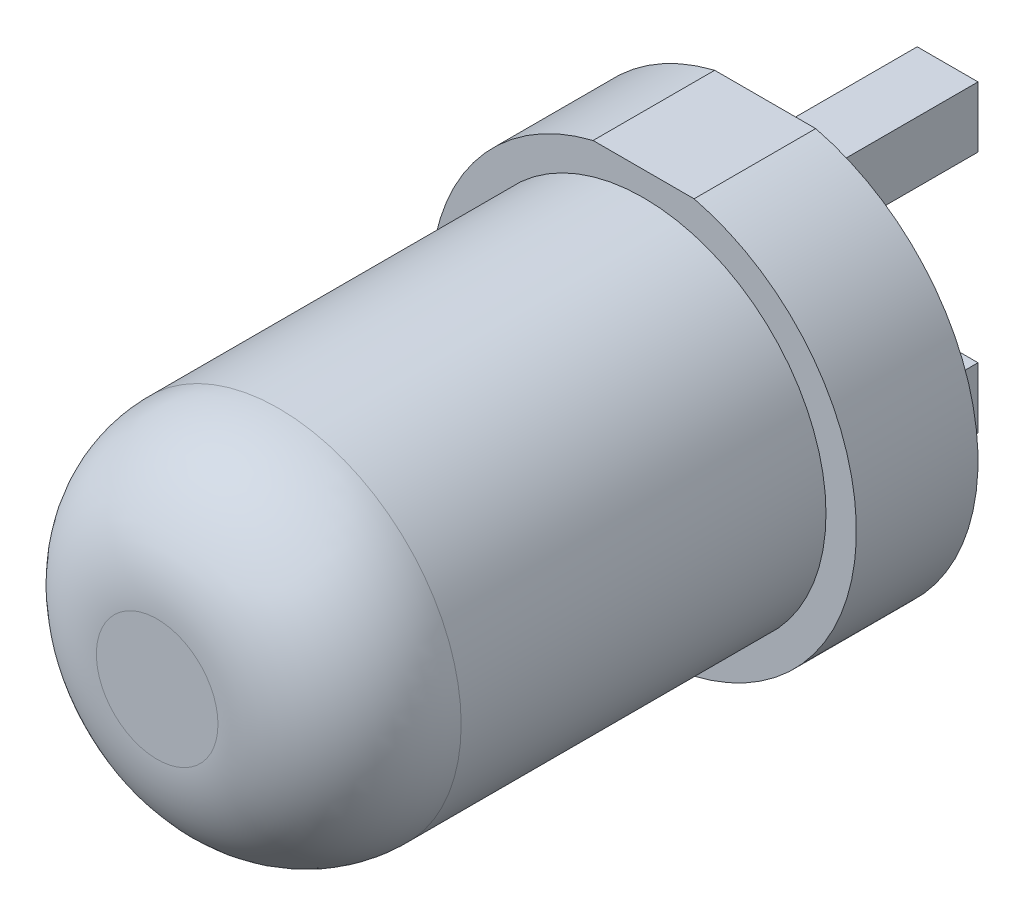
ISO-10303-21;
HEADER;
FILE_DESCRIPTION(('STEP AP214'),'2;1');
FILE_NAME('part.step','',(''),(''),'','','');
FILE_SCHEMA(('AUTOMOTIVE_DESIGN { 1 0 10303 214 1 1 1 1 }'));
ENDSEC;
DATA;
#1=APPLICATION_CONTEXT('core data for automotive mechanical design processes');
#2=APPLICATION_PROTOCOL_DEFINITION('international standard','automotive_design',2000,#1);
#3=PRODUCT_CONTEXT('',#1,'mechanical');
#4=PRODUCT('Part','Part','',(#3));
#5=PRODUCT_RELATED_PRODUCT_CATEGORY('part','',(#4));
#6=PRODUCT_DEFINITION_FORMATION('','',#4);
#7=PRODUCT_DEFINITION_CONTEXT('part definition',#1,'design');
#8=PRODUCT_DEFINITION('design','',#6,#7);
#9=PRODUCT_DEFINITION_SHAPE('','',#8);
#10=(LENGTH_UNIT() NAMED_UNIT(*) SI_UNIT(.MILLI.,.METRE.));
#11=(NAMED_UNIT(*) PLANE_ANGLE_UNIT() SI_UNIT($,.RADIAN.));
#12=(NAMED_UNIT(*) SI_UNIT($,.STERADIAN.) SOLID_ANGLE_UNIT());
#13=UNCERTAINTY_MEASURE_WITH_UNIT(LENGTH_MEASURE(1.E-05),#10,'distance_accuracy_value','');
#14=(GEOMETRIC_REPRESENTATION_CONTEXT(3) GLOBAL_UNCERTAINTY_ASSIGNED_CONTEXT((#13)) GLOBAL_UNIT_ASSIGNED_CONTEXT((#10,
#11,#12)) REPRESENTATION_CONTEXT('',''));
#15=CARTESIAN_POINT('',(0.,0.,0.));
#16=DIRECTION('',(0.,0.,1.));
#17=DIRECTION('',(1.,0.,0.));
#18=AXIS2_PLACEMENT_3D('',#15,#16,#17);
#19=CARTESIAN_POINT('',(0.,0.,-0.5));
#20=DIRECTION('',(0.,0.,1.));
#21=DIRECTION('',(1.,0.,0.));
#22=AXIS2_PLACEMENT_3D('',#19,#20,#21);
#23=PLANE('',#22);
#24=DIRECTION('',(0.,-1.,0.));
#25=VECTOR('',#24,1.);
#26=CARTESIAN_POINT('',(0.25,-0.8,-0.5));
#27=LINE('',#26,#25);
#28=CARTESIAN_POINT('',(0.25,-0.8,-0.5));
#29=VERTEX_POINT('',#28);
#30=CARTESIAN_POINT('',(0.25,-1.3,-0.5));
#31=VERTEX_POINT('',#30);
#32=EDGE_CURVE('E162',#29,#31,#27,.T.);
#33=ORIENTED_EDGE('',*,*,#32,.F.);
#34=DIRECTION('',(1.,0.,0.));
#35=VECTOR('',#34,1.);
#36=CARTESIAN_POINT('',(0.25,-0.8,-0.5));
#37=LINE('',#36,#35);
#38=CARTESIAN_POINT('',(-0.25,-0.8,-0.5));
#39=VERTEX_POINT('',#38);
#40=EDGE_CURVE('E171',#39,#29,#37,.T.);
#41=ORIENTED_EDGE('',*,*,#40,.F.);
#42=DIRECTION('',(0.,1.,0.));
#43=VECTOR('',#42,1.);
#44=CARTESIAN_POINT('',(-0.25,-0.8,-0.5));
#45=LINE('',#44,#43);
#46=CARTESIAN_POINT('',(-0.25,-1.3,-0.5));
#47=VERTEX_POINT('',#46);
#48=EDGE_CURVE('E179',#47,#39,#45,.T.);
#49=ORIENTED_EDGE('',*,*,#48,.F.);
#50=DIRECTION('',(-1.,0.,0.));
#51=VECTOR('',#50,1.);
#52=CARTESIAN_POINT('',(0.25,-1.3,-0.5));
#53=LINE('',#52,#51);
#54=EDGE_CURVE('E52',#31,#47,#53,.T.);
#55=ORIENTED_EDGE('',*,*,#54,.F.);
#56=EDGE_LOOP('',(#33,#41,#49,#55));
#57=FACE_BOUND('',#56,.T.);
#58=DIRECTION('',(0.,-1.,0.));
#59=VECTOR('',#58,1.);
#60=CARTESIAN_POINT('',(0.25,1.2,-0.5));
#61=LINE('',#60,#59);
#62=CARTESIAN_POINT('',(0.25,1.2,-0.5));
#63=VERTEX_POINT('',#62);
#64=CARTESIAN_POINT('',(0.25,0.7,-0.5));
#65=VERTEX_POINT('',#64);
#66=EDGE_CURVE('E194',#63,#65,#61,.T.);
#67=ORIENTED_EDGE('',*,*,#66,.F.);
#68=DIRECTION('',(1.,0.,0.));
#69=VECTOR('',#68,1.);
#70=CARTESIAN_POINT('',(0.25,1.2,-0.5));
#71=LINE('',#70,#69);
#72=CARTESIAN_POINT('',(-0.25,1.2,-0.5));
#73=VERTEX_POINT('',#72);
#74=EDGE_CURVE('E199',#73,#63,#71,.T.);
#75=ORIENTED_EDGE('',*,*,#74,.F.);
#76=DIRECTION('',(0.,1.,0.));
#77=VECTOR('',#76,1.);
#78=CARTESIAN_POINT('',(-0.25,1.2,-0.5));
#79=LINE('',#78,#77);
#80=CARTESIAN_POINT('',(-0.25,0.7,-0.5));
#81=VERTEX_POINT('',#80);
#82=EDGE_CURVE('E211',#81,#73,#79,.T.);
#83=ORIENTED_EDGE('',*,*,#82,.F.);
#84=DIRECTION('',(-1.,0.,0.));
#85=VECTOR('',#84,1.);
#86=CARTESIAN_POINT('',(0.25,0.7,-0.5));
#87=LINE('',#86,#85);
#88=EDGE_CURVE('E208',#65,#81,#87,.T.);
#89=ORIENTED_EDGE('',*,*,#88,.F.);
#90=EDGE_LOOP('',(#67,#75,#83,#89));
#91=FACE_BOUND('',#90,.T.);
#92=DIRECTION('',(1.,0.,0.));
#93=VECTOR('',#92,1.);
#94=CARTESIAN_POINT('',(0.,-1.7,-0.5));
#95=LINE('',#94,#93);
#96=CARTESIAN_POINT('',(-0.415331193145904,-1.7,-0.5));
#97=VERTEX_POINT('',#96);
#98=CARTESIAN_POINT('',(0.415331193145904,-1.7,-0.5));
#99=VERTEX_POINT('',#98);
#100=EDGE_CURVE('E44',#97,#99,#95,.T.);
#101=ORIENTED_EDGE('',*,*,#100,.F.);
#102=CARTESIAN_POINT('',(0.,0.,-0.5));
#103=DIRECTION('',(0.,0.,1.));
#104=DIRECTION('',(1.,0.,0.));
#105=AXIS2_PLACEMENT_3D('',#102,#103,#104);
#106=CIRCLE('',#105,1.75);
#107=CARTESIAN_POINT('',(-0.415331193145904,1.7,-0.5));
#108=VERTEX_POINT('',#107);
#109=EDGE_CURVE('E136',#108,#97,#106,.T.);
#110=ORIENTED_EDGE('',*,*,#109,.F.);
#111=DIRECTION('',(-1.,0.,0.));
#112=VECTOR('',#111,1.);
#113=CARTESIAN_POINT('',(0.,1.7,-0.5));
#114=LINE('',#113,#112);
#115=CARTESIAN_POINT('',(0.415331193145904,1.7,-0.5));
#116=VERTEX_POINT('',#115);
#117=EDGE_CURVE('E122',#116,#108,#114,.T.);
#118=ORIENTED_EDGE('',*,*,#117,.F.);
#119=EDGE_CURVE('E140',#99,#116,#106,.T.);
#120=ORIENTED_EDGE('',*,*,#119,.F.);
#121=EDGE_LOOP('',(#101,#110,#118,#120));
#122=FACE_BOUND('',#121,.T.);
#123=ADVANCED_FACE('F30',(#57,#91,#122),#23,.F.);
#124=CARTESIAN_POINT('',(0.,0.,0.5));
#125=DIRECTION('',(0.,0.,1.));
#126=DIRECTION('',(1.,0.,0.));
#127=AXIS2_PLACEMENT_3D('',#124,#125,#126);
#128=PLANE('',#127);
#129=CARTESIAN_POINT('',(0.,0.,0.5));
#130=DIRECTION('',(0.,0.,1.));
#131=DIRECTION('',(1.,0.,0.));
#132=AXIS2_PLACEMENT_3D('',#129,#130,#131);
#133=CIRCLE('',#132,1.5);
#134=CARTESIAN_POINT('',(1.5,0.,0.5));
#135=VERTEX_POINT('',#134);
#136=EDGE_CURVE('E143',#135,#135,#133,.T.);
#137=ORIENTED_EDGE('',*,*,#136,.F.);
#138=EDGE_LOOP('',(#137));
#139=FACE_BOUND('',#138,.T.);
#140=CARTESIAN_POINT('',(0.,0.,0.5));
#141=DIRECTION('',(0.,0.,1.));
#142=DIRECTION('',(1.,0.,0.));
#143=AXIS2_PLACEMENT_3D('',#140,#141,#142);
#144=CIRCLE('',#143,1.75);
#145=CARTESIAN_POINT('',(-0.415331193145904,1.7,0.5));
#146=VERTEX_POINT('',#145);
#147=CARTESIAN_POINT('',(-0.415331193145904,-1.7,0.5));
#148=VERTEX_POINT('',#147);
#149=EDGE_CURVE('E130',#146,#148,#144,.T.);
#150=ORIENTED_EDGE('',*,*,#149,.T.);
#151=DIRECTION('',(1.,0.,0.));
#152=VECTOR('',#151,1.);
#153=CARTESIAN_POINT('',(0.,-1.7,0.5));
#154=LINE('',#153,#152);
#155=CARTESIAN_POINT('',(0.415331193145904,-1.7,0.5));
#156=VERTEX_POINT('',#155);
#157=EDGE_CURVE('E117',#148,#156,#154,.T.);
#158=ORIENTED_EDGE('',*,*,#157,.T.);
#159=CARTESIAN_POINT('',(0.415331193145904,1.7,0.5));
#160=VERTEX_POINT('',#159);
#161=EDGE_CURVE('E127',#156,#160,#144,.T.);
#162=ORIENTED_EDGE('',*,*,#161,.T.);
#163=DIRECTION('',(-1.,0.,0.));
#164=VECTOR('',#163,1.);
#165=CARTESIAN_POINT('',(0.,1.7,0.5));
#166=LINE('',#165,#164);
#167=EDGE_CURVE('E226',#160,#146,#166,.T.);
#168=ORIENTED_EDGE('',*,*,#167,.T.);
#169=EDGE_LOOP('',(#150,#158,#162,#168));
#170=FACE_BOUND('',#169,.T.);
#171=ADVANCED_FACE('F125',(#139,#170),#128,.T.);
#172=CARTESIAN_POINT('',(0.,0.,0.5));
#173=DIRECTION('',(0.,0.,-1.));
#174=DIRECTION('',(-1.,0.,0.));
#175=AXIS2_PLACEMENT_3D('',#172,#173,#174);
#176=CYLINDRICAL_SURFACE('',#175,1.75);
#177=DIRECTION('',(0.,0.,-1.));
#178=VECTOR('',#177,1.);
#179=CARTESIAN_POINT('',(-0.415331193145904,-1.7,0.5));
#180=LINE('',#179,#178);
#181=EDGE_CURVE('E11',#148,#97,#180,.T.);
#182=ORIENTED_EDGE('',*,*,#181,.F.);
#183=ORIENTED_EDGE('',*,*,#149,.F.);
#184=DIRECTION('',(0.,0.,-1.));
#185=VECTOR('',#184,1.);
#186=CARTESIAN_POINT('',(-0.415331193145904,1.7,0.5));
#187=LINE('',#186,#185);
#188=EDGE_CURVE('E155',#108,#146,#187,.F.);
#189=ORIENTED_EDGE('',*,*,#188,.F.);
#190=ORIENTED_EDGE('',*,*,#109,.T.);
#191=EDGE_LOOP('',(#182,#183,#189,#190));
#192=FACE_BOUND('',#191,.T.);
#193=ADVANCED_FACE('F159',(#192),#176,.T.);
#194=DIRECTION('',(0.,0.,-1.));
#195=VECTOR('',#194,1.);
#196=CARTESIAN_POINT('',(0.415331193145904,-1.7,0.5));
#197=LINE('',#196,#195);
#198=EDGE_CURVE('E38',#99,#156,#197,.F.);
#199=ORIENTED_EDGE('',*,*,#198,.F.);
#200=ORIENTED_EDGE('',*,*,#119,.T.);
#201=DIRECTION('',(0.,0.,-1.));
#202=VECTOR('',#201,1.);
#203=CARTESIAN_POINT('',(0.415331193145904,1.7,0.5));
#204=LINE('',#203,#202);
#205=EDGE_CURVE('E135',#160,#116,#204,.T.);
#206=ORIENTED_EDGE('',*,*,#205,.F.);
#207=ORIENTED_EDGE('',*,*,#161,.F.);
#208=EDGE_LOOP('',(#199,#200,#206,#207));
#209=FACE_BOUND('',#208,.T.);
#210=ADVANCED_FACE('F133',(#209),#176,.T.);
#211=CARTESIAN_POINT('',(0.,0.,4.5));
#212=DIRECTION('',(0.,0.,-1.));
#213=DIRECTION('',(-1.,0.,0.));
#214=AXIS2_PLACEMENT_3D('',#211,#212,#213);
#215=CYLINDRICAL_SURFACE('',#214,1.5);
#216=CARTESIAN_POINT('',(0.,0.,3.5));
#217=DIRECTION('',(0.,0.,1.));
#218=DIRECTION('',(1.,0.,0.));
#219=AXIS2_PLACEMENT_3D('',#216,#217,#218);
#220=CIRCLE('',#219,1.5);
#221=CARTESIAN_POINT('',(1.5,0.,3.5));
#222=VERTEX_POINT('',#221);
#223=EDGE_CURVE('E148',#222,#222,#220,.F.);
#224=ORIENTED_EDGE('',*,*,#223,.T.);
#225=EDGE_LOOP('',(#224));
#226=FACE_BOUND('',#225,.T.);
#227=ORIENTED_EDGE('',*,*,#136,.T.);
#228=EDGE_LOOP('',(#227));
#229=FACE_BOUND('',#228,.T.);
#230=ADVANCED_FACE('F230',(#226,#229),#215,.T.);
#231=CARTESIAN_POINT('',(0.,0.,4.5));
#232=DIRECTION('',(0.,0.,1.));
#233=DIRECTION('',(1.,0.,0.));
#234=AXIS2_PLACEMENT_3D('',#231,#232,#233);
#235=PLANE('',#234);
#236=CARTESIAN_POINT('',(0.,0.,4.5));
#237=DIRECTION('',(0.,0.,1.));
#238=DIRECTION('',(1.,0.,0.));
#239=AXIS2_PLACEMENT_3D('',#236,#237,#238);
#240=CIRCLE('',#239,0.5);
#241=CARTESIAN_POINT('',(0.5,0.,4.5));
#242=VERTEX_POINT('',#241);
#243=EDGE_CURVE('E138',#242,#242,#240,.T.);
#244=ORIENTED_EDGE('',*,*,#243,.T.);
#245=EDGE_LOOP('',(#244));
#246=FACE_BOUND('',#245,.T.);
#247=ADVANCED_FACE('F242',(#246),#235,.T.);
#248=CARTESIAN_POINT('',(0.,0.,3.5));
#249=DIRECTION('',(0.,0.,1.));
#250=DIRECTION('',(1.,0.,0.));
#251=AXIS2_PLACEMENT_3D('',#248,#249,#250);
#252=DEGENERATE_TOROIDAL_SURFACE('',#251,0.5,1.,.T.);
#253=ORIENTED_EDGE('',*,*,#223,.F.);
#254=EDGE_LOOP('',(#253));
#255=FACE_BOUND('',#254,.T.);
#256=ORIENTED_EDGE('',*,*,#243,.F.);
#257=EDGE_LOOP('',(#256));
#258=FACE_BOUND('',#257,.T.);
#259=ADVANCED_FACE('F32',(#255,#258),#252,.T.);
#260=CARTESIAN_POINT('',(-4.59893373624709,1.7,3.07803442353816));
#261=DIRECTION('',(0.,1.,0.));
#262=DIRECTION('',(0.,0.,1.));
#263=AXIS2_PLACEMENT_3D('',#260,#261,#262);
#264=PLANE('',#263);
#265=ORIENTED_EDGE('',*,*,#205,.T.);
#266=ORIENTED_EDGE('',*,*,#117,.T.);
#267=ORIENTED_EDGE('',*,*,#188,.T.);
#268=ORIENTED_EDGE('',*,*,#167,.F.);
#269=EDGE_LOOP('',(#265,#266,#267,#268));
#270=FACE_BOUND('',#269,.T.);
#271=ADVANCED_FACE('F154',(#270),#264,.T.);
#272=CARTESIAN_POINT('',(0.25,1.2,-2.));
#273=DIRECTION('',(-1.,0.,0.));
#274=DIRECTION('',(0.,0.,1.));
#275=AXIS2_PLACEMENT_3D('',#272,#273,#274);
#276=PLANE('',#275);
#277=ORIENTED_EDGE('',*,*,#66,.T.);
#278=DIRECTION('',(0.,0.,1.));
#279=VECTOR('',#278,1.);
#280=CARTESIAN_POINT('',(0.25,0.7,-2.));
#281=LINE('',#280,#279);
#282=CARTESIAN_POINT('',(0.25,0.7,-2.));
#283=VERTEX_POINT('',#282);
#284=EDGE_CURVE('E160',#283,#65,#281,.T.);
#285=ORIENTED_EDGE('',*,*,#284,.F.);
#286=DIRECTION('',(0.,-1.,0.));
#287=VECTOR('',#286,1.);
#288=CARTESIAN_POINT('',(0.25,1.2,-2.));
#289=LINE('',#288,#287);
#290=CARTESIAN_POINT('',(0.25,1.2,-2.));
#291=VERTEX_POINT('',#290);
#292=EDGE_CURVE('E195',#291,#283,#289,.T.);
#293=ORIENTED_EDGE('',*,*,#292,.F.);
#294=DIRECTION('',(0.,0.,1.));
#295=VECTOR('',#294,1.);
#296=CARTESIAN_POINT('',(0.25,1.2,-2.));
#297=LINE('',#296,#295);
#298=EDGE_CURVE('E205',#291,#63,#297,.T.);
#299=ORIENTED_EDGE('',*,*,#298,.T.);
#300=EDGE_LOOP('',(#277,#285,#293,#299));
#301=FACE_BOUND('',#300,.T.);
#302=ADVANCED_FACE('F249',(#301),#276,.F.);
#303=CARTESIAN_POINT('',(0.25,0.7,-2.));
#304=DIRECTION('',(0.,1.,0.));
#305=DIRECTION('',(0.,0.,1.));
#306=AXIS2_PLACEMENT_3D('',#303,#304,#305);
#307=PLANE('',#306);
#308=ORIENTED_EDGE('',*,*,#88,.T.);
#309=DIRECTION('',(0.,0.,1.));
#310=VECTOR('',#309,1.);
#311=CARTESIAN_POINT('',(-0.25,0.7,-2.));
#312=LINE('',#311,#310);
#313=CARTESIAN_POINT('',(-0.25,0.7,-2.));
#314=VERTEX_POINT('',#313);
#315=EDGE_CURVE('E221',#314,#81,#312,.T.);
#316=ORIENTED_EDGE('',*,*,#315,.F.);
#317=DIRECTION('',(-1.,0.,0.));
#318=VECTOR('',#317,1.);
#319=CARTESIAN_POINT('',(0.25,0.7,-2.));
#320=LINE('',#319,#318);
#321=EDGE_CURVE('E198',#283,#314,#320,.T.);
#322=ORIENTED_EDGE('',*,*,#321,.F.);
#323=ORIENTED_EDGE('',*,*,#284,.T.);
#324=EDGE_LOOP('',(#308,#316,#322,#323));
#325=FACE_BOUND('',#324,.T.);
#326=ADVANCED_FACE('F252',(#325),#307,.F.);
#327=CARTESIAN_POINT('',(-0.25,1.2,-2.));
#328=DIRECTION('',(1.,0.,0.));
#329=DIRECTION('',(0.,0.,-1.));
#330=AXIS2_PLACEMENT_3D('',#327,#328,#329);
#331=PLANE('',#330);
#332=ORIENTED_EDGE('',*,*,#82,.T.);
#333=DIRECTION('',(0.,0.,1.));
#334=VECTOR('',#333,1.);
#335=CARTESIAN_POINT('',(-0.25,1.2,-2.));
#336=LINE('',#335,#334);
#337=CARTESIAN_POINT('',(-0.25,1.2,-2.));
#338=VERTEX_POINT('',#337);
#339=EDGE_CURVE('E218',#338,#73,#336,.T.);
#340=ORIENTED_EDGE('',*,*,#339,.F.);
#341=DIRECTION('',(0.,1.,0.));
#342=VECTOR('',#341,1.);
#343=CARTESIAN_POINT('',(-0.25,1.2,-2.));
#344=LINE('',#343,#342);
#345=EDGE_CURVE('E201',#314,#338,#344,.T.);
#346=ORIENTED_EDGE('',*,*,#345,.F.);
#347=ORIENTED_EDGE('',*,*,#315,.T.);
#348=EDGE_LOOP('',(#332,#340,#346,#347));
#349=FACE_BOUND('',#348,.T.);
#350=ADVANCED_FACE('F256',(#349),#331,.F.);
#351=CARTESIAN_POINT('',(0.25,1.2,-2.));
#352=DIRECTION('',(0.,-1.,0.));
#353=DIRECTION('',(0.,0.,-1.));
#354=AXIS2_PLACEMENT_3D('',#351,#352,#353);
#355=PLANE('',#354);
#356=ORIENTED_EDGE('',*,*,#74,.T.);
#357=ORIENTED_EDGE('',*,*,#298,.F.);
#358=DIRECTION('',(1.,0.,0.));
#359=VECTOR('',#358,1.);
#360=CARTESIAN_POINT('',(0.25,1.2,-2.));
#361=LINE('',#360,#359);
#362=EDGE_CURVE('E203',#338,#291,#361,.T.);
#363=ORIENTED_EDGE('',*,*,#362,.F.);
#364=ORIENTED_EDGE('',*,*,#339,.T.);
#365=EDGE_LOOP('',(#356,#357,#363,#364));
#366=FACE_BOUND('',#365,.T.);
#367=ADVANCED_FACE('F260',(#366),#355,.F.);
#368=CARTESIAN_POINT('',(0.25,0.7,-2.));
#369=DIRECTION('',(0.,0.,-1.));
#370=DIRECTION('',(-1.,0.,0.));
#371=AXIS2_PLACEMENT_3D('',#368,#369,#370);
#372=PLANE('',#371);
#373=ORIENTED_EDGE('',*,*,#292,.T.);
#374=ORIENTED_EDGE('',*,*,#321,.T.);
#375=ORIENTED_EDGE('',*,*,#345,.T.);
#376=ORIENTED_EDGE('',*,*,#362,.T.);
#377=EDGE_LOOP('',(#373,#374,#375,#376));
#378=FACE_BOUND('',#377,.T.);
#379=ADVANCED_FACE('F264',(#378),#372,.T.);
#380=CARTESIAN_POINT('',(0.25,-0.8,-2.));
#381=DIRECTION('',(-1.,0.,0.));
#382=DIRECTION('',(0.,0.,1.));
#383=AXIS2_PLACEMENT_3D('',#380,#381,#382);
#384=PLANE('',#383);
#385=ORIENTED_EDGE('',*,*,#32,.T.);
#386=DIRECTION('',(0.,0.,1.));
#387=VECTOR('',#386,1.);
#388=CARTESIAN_POINT('',(0.25,-1.3,-2.));
#389=LINE('',#388,#387);
#390=CARTESIAN_POINT('',(0.25,-1.3,-2.));
#391=VERTEX_POINT('',#390);
#392=EDGE_CURVE('E192',#391,#31,#389,.T.);
#393=ORIENTED_EDGE('',*,*,#392,.F.);
#394=DIRECTION('',(0.,-1.,0.));
#395=VECTOR('',#394,1.);
#396=CARTESIAN_POINT('',(0.25,-0.8,-2.));
#397=LINE('',#396,#395);
#398=CARTESIAN_POINT('',(0.25,-0.8,-2.));
#399=VERTEX_POINT('',#398);
#400=EDGE_CURVE('E167',#399,#391,#397,.T.);
#401=ORIENTED_EDGE('',*,*,#400,.F.);
#402=DIRECTION('',(0.,0.,1.));
#403=VECTOR('',#402,1.);
#404=CARTESIAN_POINT('',(0.25,-0.8,-2.));
#405=LINE('',#404,#403);
#406=EDGE_CURVE('E176',#399,#29,#405,.T.);
#407=ORIENTED_EDGE('',*,*,#406,.T.);
#408=EDGE_LOOP('',(#385,#393,#401,#407));
#409=FACE_BOUND('',#408,.T.);
#410=ADVANCED_FACE('F268',(#409),#384,.F.);
#411=CARTESIAN_POINT('',(0.25,-1.3,-2.));
#412=DIRECTION('',(0.,1.,0.));
#413=DIRECTION('',(0.,0.,1.));
#414=AXIS2_PLACEMENT_3D('',#411,#412,#413);
#415=PLANE('',#414);
#416=ORIENTED_EDGE('',*,*,#54,.T.);
#417=DIRECTION('',(0.,0.,1.));
#418=VECTOR('',#417,1.);
#419=CARTESIAN_POINT('',(-0.25,-1.3,-2.));
#420=LINE('',#419,#418);
#421=CARTESIAN_POINT('',(-0.25,-1.3,-2.));
#422=VERTEX_POINT('',#421);
#423=EDGE_CURVE('E189',#422,#47,#420,.T.);
#424=ORIENTED_EDGE('',*,*,#423,.F.);
#425=DIRECTION('',(-1.,0.,0.));
#426=VECTOR('',#425,1.);
#427=CARTESIAN_POINT('',(0.25,-1.3,-2.));
#428=LINE('',#427,#426);
#429=EDGE_CURVE('E170',#391,#422,#428,.T.);
#430=ORIENTED_EDGE('',*,*,#429,.F.);
#431=ORIENTED_EDGE('',*,*,#392,.T.);
#432=EDGE_LOOP('',(#416,#424,#430,#431));
#433=FACE_BOUND('',#432,.T.);
#434=ADVANCED_FACE('F272',(#433),#415,.F.);
#435=CARTESIAN_POINT('',(-0.25,-0.8,-2.));
#436=DIRECTION('',(1.,0.,0.));
#437=DIRECTION('',(0.,0.,-1.));
#438=AXIS2_PLACEMENT_3D('',#435,#436,#437);
#439=PLANE('',#438);
#440=ORIENTED_EDGE('',*,*,#48,.T.);
#441=DIRECTION('',(0.,0.,1.));
#442=VECTOR('',#441,1.);
#443=CARTESIAN_POINT('',(-0.25,-0.8,-2.));
#444=LINE('',#443,#442);
#445=CARTESIAN_POINT('',(-0.25,-0.8,-2.));
#446=VERTEX_POINT('',#445);
#447=EDGE_CURVE('E186',#446,#39,#444,.T.);
#448=ORIENTED_EDGE('',*,*,#447,.F.);
#449=DIRECTION('',(0.,1.,0.));
#450=VECTOR('',#449,1.);
#451=CARTESIAN_POINT('',(-0.25,-0.8,-2.));
#452=LINE('',#451,#450);
#453=EDGE_CURVE('E173',#422,#446,#452,.T.);
#454=ORIENTED_EDGE('',*,*,#453,.F.);
#455=ORIENTED_EDGE('',*,*,#423,.T.);
#456=EDGE_LOOP('',(#440,#448,#454,#455));
#457=FACE_BOUND('',#456,.T.);
#458=ADVANCED_FACE('F276',(#457),#439,.F.);
#459=CARTESIAN_POINT('',(0.25,-0.8,-2.));
#460=DIRECTION('',(0.,-1.,0.));
#461=DIRECTION('',(1.,0.,0.));
#462=AXIS2_PLACEMENT_3D('',#459,#460,#461);
#463=PLANE('',#462);
#464=ORIENTED_EDGE('',*,*,#40,.T.);
#465=ORIENTED_EDGE('',*,*,#406,.F.);
#466=DIRECTION('',(1.,0.,0.));
#467=VECTOR('',#466,1.);
#468=CARTESIAN_POINT('',(0.25,-0.8,-2.));
#469=LINE('',#468,#467);
#470=EDGE_CURVE('E175',#446,#399,#469,.T.);
#471=ORIENTED_EDGE('',*,*,#470,.F.);
#472=ORIENTED_EDGE('',*,*,#447,.T.);
#473=EDGE_LOOP('',(#464,#465,#471,#472));
#474=FACE_BOUND('',#473,.T.);
#475=ADVANCED_FACE('F280',(#474),#463,.F.);
#476=CARTESIAN_POINT('',(0.25,-1.3,-2.));
#477=DIRECTION('',(0.,0.,-1.));
#478=DIRECTION('',(-1.,0.,0.));
#479=AXIS2_PLACEMENT_3D('',#476,#477,#478);
#480=PLANE('',#479);
#481=ORIENTED_EDGE('',*,*,#400,.T.);
#482=ORIENTED_EDGE('',*,*,#429,.T.);
#483=ORIENTED_EDGE('',*,*,#453,.T.);
#484=ORIENTED_EDGE('',*,*,#470,.T.);
#485=EDGE_LOOP('',(#481,#482,#483,#484));
#486=FACE_BOUND('',#485,.T.);
#487=ADVANCED_FACE('F284',(#486),#480,.T.);
#488=CARTESIAN_POINT('',(-4.59893373624709,-1.7,3.07803442353816));
#489=DIRECTION('',(0.,-1.,0.));
#490=DIRECTION('',(0.,0.,1.));
#491=AXIS2_PLACEMENT_3D('',#488,#489,#490);
#492=PLANE('',#491);
#493=ORIENTED_EDGE('',*,*,#181,.T.);
#494=ORIENTED_EDGE('',*,*,#100,.T.);
#495=ORIENTED_EDGE('',*,*,#198,.T.);
#496=ORIENTED_EDGE('',*,*,#157,.F.);
#497=EDGE_LOOP('',(#493,#494,#495,#496));
#498=FACE_BOUND('',#497,.T.);
#499=ADVANCED_FACE('F116',(#498),#492,.T.);
#500=CLOSED_SHELL('',(#123,#171,#193,#210,#230,#247,#259,#271,#302,#326,#350,#367,#379,#410,
#434,#458,#475,#487,#499));
#501=MANIFOLD_SOLID_BREP('B2',#500);
#502=ADVANCED_BREP_SHAPE_REPRESENTATION('',(#18,#501),#14);
#503=SHAPE_DEFINITION_REPRESENTATION(#9,#502);
ENDSEC;
END-ISO-10303-21;
